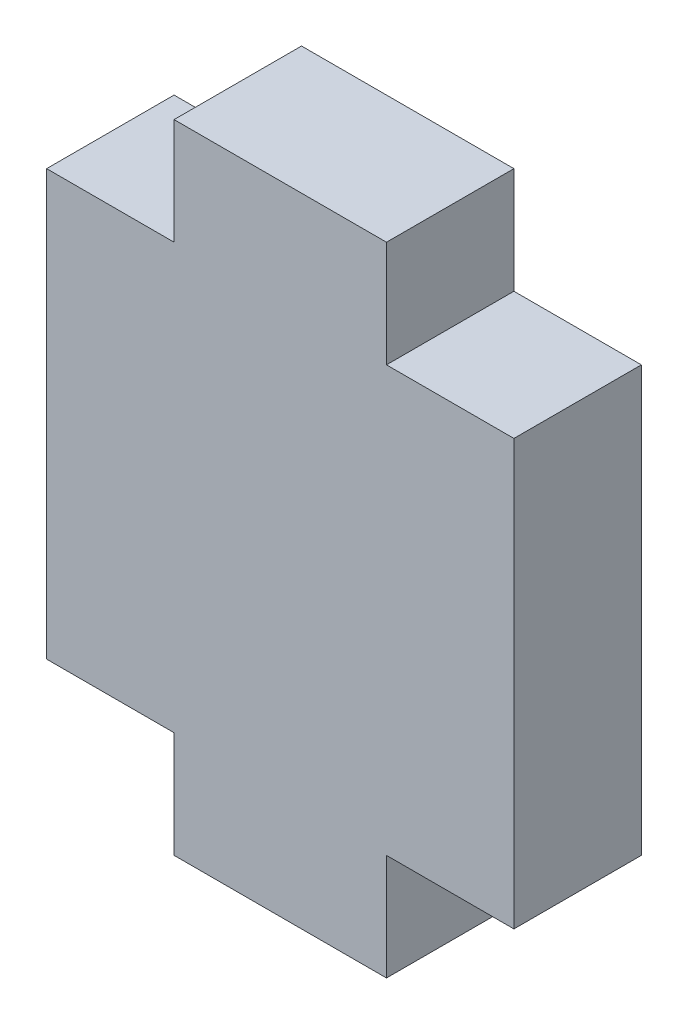
ISO-10303-21;
HEADER;
FILE_DESCRIPTION(('STEP AP214'),'2;1');
FILE_NAME('part.step','',(''),(''),'','','');
FILE_SCHEMA(('AUTOMOTIVE_DESIGN { 1 0 10303 214 1 1 1 1 }'));
ENDSEC;
DATA;
#1=APPLICATION_CONTEXT('core data for automotive mechanical design processes');
#2=APPLICATION_PROTOCOL_DEFINITION('international standard','automotive_design',2000,#1);
#3=PRODUCT_CONTEXT('',#1,'mechanical');
#4=PRODUCT('Part','Part','',(#3));
#5=PRODUCT_RELATED_PRODUCT_CATEGORY('part','',(#4));
#6=PRODUCT_DEFINITION_FORMATION('','',#4);
#7=PRODUCT_DEFINITION_CONTEXT('part definition',#1,'design');
#8=PRODUCT_DEFINITION('design','',#6,#7);
#9=PRODUCT_DEFINITION_SHAPE('','',#8);
#10=(LENGTH_UNIT() NAMED_UNIT(*) SI_UNIT(.MILLI.,.METRE.));
#11=(NAMED_UNIT(*) PLANE_ANGLE_UNIT() SI_UNIT($,.RADIAN.));
#12=(NAMED_UNIT(*) SI_UNIT($,.STERADIAN.) SOLID_ANGLE_UNIT());
#13=UNCERTAINTY_MEASURE_WITH_UNIT(LENGTH_MEASURE(1.E-05),#10,'distance_accuracy_value','');
#14=(GEOMETRIC_REPRESENTATION_CONTEXT(3) GLOBAL_UNCERTAINTY_ASSIGNED_CONTEXT((#13)) GLOBAL_UNIT_ASSIGNED_CONTEXT((#10,
#11,#12)) REPRESENTATION_CONTEXT('',''));
#15=CARTESIAN_POINT('',(0.,0.,0.));
#16=DIRECTION('',(0.,0.,1.));
#17=DIRECTION('',(1.,0.,0.));
#18=AXIS2_PLACEMENT_3D('',#15,#16,#17);
#19=CARTESIAN_POINT('',(0.,5.,3.));
#20=DIRECTION('',(0.,-1.,0.));
#21=DIRECTION('',(0.,0.,-1.));
#22=AXIS2_PLACEMENT_3D('',#19,#20,#21);
#23=PLANE('',#22);
#24=DIRECTION('',(-1.,0.,0.));
#25=VECTOR('',#24,1.);
#26=CARTESIAN_POINT('',(0.,5.,0.));
#27=LINE('',#26,#25);
#28=CARTESIAN_POINT('',(-2.5,5.,0.));
#29=VERTEX_POINT('',#28);
#30=CARTESIAN_POINT('',(-5.5,5.,0.));
#31=VERTEX_POINT('',#30);
#32=EDGE_CURVE('E158',#29,#31,#27,.T.);
#33=ORIENTED_EDGE('',*,*,#32,.T.);
#34=DIRECTION('',(0.,0.,-1.));
#35=VECTOR('',#34,1.);
#36=CARTESIAN_POINT('',(-5.5,5.,3.));
#37=LINE('',#36,#35);
#38=CARTESIAN_POINT('',(-5.5,5.,3.));
#39=VERTEX_POINT('',#38);
#40=EDGE_CURVE('E11',#39,#31,#37,.T.);
#41=ORIENTED_EDGE('',*,*,#40,.F.);
#42=DIRECTION('',(-1.,0.,0.));
#43=VECTOR('',#42,1.);
#44=CARTESIAN_POINT('',(0.,5.,3.));
#45=LINE('',#44,#43);
#46=CARTESIAN_POINT('',(-2.5,5.,3.));
#47=VERTEX_POINT('',#46);
#48=EDGE_CURVE('E236',#47,#39,#45,.T.);
#49=ORIENTED_EDGE('',*,*,#48,.F.);
#50=DIRECTION('',(0.,0.,-1.));
#51=VECTOR('',#50,1.);
#52=CARTESIAN_POINT('',(-2.5,5.,3.));
#53=LINE('',#52,#51);
#54=EDGE_CURVE('E152',#47,#29,#53,.T.);
#55=ORIENTED_EDGE('',*,*,#54,.T.);
#56=EDGE_LOOP('',(#33,#41,#49,#55));
#57=FACE_BOUND('',#56,.T.);
#58=ADVANCED_FACE('F36',(#57),#23,.F.);
#59=CARTESIAN_POINT('',(-5.5,0.,3.));
#60=DIRECTION('',(1.,0.,0.));
#61=DIRECTION('',(0.,1.,0.));
#62=AXIS2_PLACEMENT_3D('',#59,#60,#61);
#63=PLANE('',#62);
#64=DIRECTION('',(0.,-1.,0.));
#65=VECTOR('',#64,1.);
#66=CARTESIAN_POINT('',(-5.5,0.,0.));
#67=LINE('',#66,#65);
#68=CARTESIAN_POINT('',(-5.5,-5.,0.));
#69=VERTEX_POINT('',#68);
#70=EDGE_CURVE('E161',#31,#69,#67,.T.);
#71=ORIENTED_EDGE('',*,*,#70,.T.);
#72=DIRECTION('',(0.,0.,-1.));
#73=VECTOR('',#72,1.);
#74=CARTESIAN_POINT('',(-5.5,-5.,3.));
#75=LINE('',#74,#73);
#76=CARTESIAN_POINT('',(-5.5,-5.,3.));
#77=VERTEX_POINT('',#76);
#78=EDGE_CURVE('E44',#77,#69,#75,.T.);
#79=ORIENTED_EDGE('',*,*,#78,.F.);
#80=DIRECTION('',(0.,-1.,0.));
#81=VECTOR('',#80,1.);
#82=CARTESIAN_POINT('',(-5.5,0.,3.));
#83=LINE('',#82,#81);
#84=EDGE_CURVE('E103',#39,#77,#83,.T.);
#85=ORIENTED_EDGE('',*,*,#84,.F.);
#86=ORIENTED_EDGE('',*,*,#40,.T.);
#87=EDGE_LOOP('',(#71,#79,#85,#86));
#88=FACE_BOUND('',#87,.T.);
#89=ADVANCED_FACE('F207',(#88),#63,.F.);
#90=CARTESIAN_POINT('',(0.,-5.,3.));
#91=DIRECTION('',(0.,-1.,0.));
#92=DIRECTION('',(1.,0.,0.));
#93=AXIS2_PLACEMENT_3D('',#90,#91,#92);
#94=PLANE('',#93);
#95=DIRECTION('',(-1.,0.,0.));
#96=VECTOR('',#95,1.);
#97=CARTESIAN_POINT('',(0.,-5.,0.));
#98=LINE('',#97,#96);
#99=CARTESIAN_POINT('',(-2.5,-5.,0.));
#100=VERTEX_POINT('',#99);
#101=EDGE_CURVE('E164',#100,#69,#98,.T.);
#102=ORIENTED_EDGE('',*,*,#101,.F.);
#103=DIRECTION('',(0.,0.,-1.));
#104=VECTOR('',#103,1.);
#105=CARTESIAN_POINT('',(-2.5,-5.,3.));
#106=LINE('',#105,#104);
#107=CARTESIAN_POINT('',(-2.5,-5.,3.));
#108=VERTEX_POINT('',#107);
#109=EDGE_CURVE('E200',#108,#100,#106,.T.);
#110=ORIENTED_EDGE('',*,*,#109,.F.);
#111=DIRECTION('',(-1.,0.,0.));
#112=VECTOR('',#111,1.);
#113=CARTESIAN_POINT('',(0.,-5.,3.));
#114=LINE('',#113,#112);
#115=EDGE_CURVE('E206',#108,#77,#114,.T.);
#116=ORIENTED_EDGE('',*,*,#115,.T.);
#117=ORIENTED_EDGE('',*,*,#78,.T.);
#118=EDGE_LOOP('',(#102,#110,#116,#117));
#119=FACE_BOUND('',#118,.T.);
#120=ADVANCED_FACE('F204',(#119),#94,.T.);
#121=CARTESIAN_POINT('',(-2.5,0.,3.));
#122=DIRECTION('',(1.,0.,0.));
#123=DIRECTION('',(0.,1.,0.));
#124=AXIS2_PLACEMENT_3D('',#121,#122,#123);
#125=PLANE('',#124);
#126=DIRECTION('',(0.,-1.,0.));
#127=VECTOR('',#126,1.);
#128=CARTESIAN_POINT('',(-2.5,0.,0.));
#129=LINE('',#128,#127);
#130=CARTESIAN_POINT('',(-2.5,-7.5,0.));
#131=VERTEX_POINT('',#130);
#132=EDGE_CURVE('E167',#100,#131,#129,.T.);
#133=ORIENTED_EDGE('',*,*,#132,.T.);
#134=DIRECTION('',(0.,0.,-1.));
#135=VECTOR('',#134,1.);
#136=CARTESIAN_POINT('',(-2.5,-7.5,3.));
#137=LINE('',#136,#135);
#138=CARTESIAN_POINT('',(-2.5,-7.5,3.));
#139=VERTEX_POINT('',#138);
#140=EDGE_CURVE('E197',#139,#131,#137,.T.);
#141=ORIENTED_EDGE('',*,*,#140,.F.);
#142=DIRECTION('',(0.,-1.,0.));
#143=VECTOR('',#142,1.);
#144=CARTESIAN_POINT('',(-2.5,0.,3.));
#145=LINE('',#144,#143);
#146=EDGE_CURVE('E154',#108,#139,#145,.T.);
#147=ORIENTED_EDGE('',*,*,#146,.F.);
#148=ORIENTED_EDGE('',*,*,#109,.T.);
#149=EDGE_LOOP('',(#133,#141,#147,#148));
#150=FACE_BOUND('',#149,.T.);
#151=ADVANCED_FACE('F216',(#150),#125,.F.);
#152=CARTESIAN_POINT('',(0.,-7.5,3.));
#153=DIRECTION('',(0.,1.,0.));
#154=DIRECTION('',(0.,0.,1.));
#155=AXIS2_PLACEMENT_3D('',#152,#153,#154);
#156=PLANE('',#155);
#157=DIRECTION('',(1.,0.,0.));
#158=VECTOR('',#157,1.);
#159=CARTESIAN_POINT('',(0.,-7.5,0.));
#160=LINE('',#159,#158);
#161=CARTESIAN_POINT('',(2.5,-7.5,0.));
#162=VERTEX_POINT('',#161);
#163=EDGE_CURVE('E169',#131,#162,#160,.T.);
#164=ORIENTED_EDGE('',*,*,#163,.T.);
#165=DIRECTION('',(0.,0.,-1.));
#166=VECTOR('',#165,1.);
#167=CARTESIAN_POINT('',(2.5,-7.5,3.));
#168=LINE('',#167,#166);
#169=CARTESIAN_POINT('',(2.5,-7.5,3.));
#170=VERTEX_POINT('',#169);
#171=EDGE_CURVE('E195',#170,#162,#168,.T.);
#172=ORIENTED_EDGE('',*,*,#171,.F.);
#173=DIRECTION('',(1.,0.,0.));
#174=VECTOR('',#173,1.);
#175=CARTESIAN_POINT('',(0.,-7.5,3.));
#176=LINE('',#175,#174);
#177=EDGE_CURVE('E222',#139,#170,#176,.T.);
#178=ORIENTED_EDGE('',*,*,#177,.F.);
#179=ORIENTED_EDGE('',*,*,#140,.T.);
#180=EDGE_LOOP('',(#164,#172,#178,#179));
#181=FACE_BOUND('',#180,.T.);
#182=ADVANCED_FACE('F220',(#181),#156,.F.);
#183=CARTESIAN_POINT('',(2.5,0.,3.));
#184=DIRECTION('',(1.,0.,0.));
#185=DIRECTION('',(0.,1.,0.));
#186=AXIS2_PLACEMENT_3D('',#183,#184,#185);
#187=PLANE('',#186);
#188=DIRECTION('',(0.,-1.,0.));
#189=VECTOR('',#188,1.);
#190=CARTESIAN_POINT('',(2.5,0.,0.));
#191=LINE('',#190,#189);
#192=CARTESIAN_POINT('',(2.5,-5.,0.));
#193=VERTEX_POINT('',#192);
#194=EDGE_CURVE('E172',#193,#162,#191,.T.);
#195=ORIENTED_EDGE('',*,*,#194,.F.);
#196=DIRECTION('',(0.,0.,-1.));
#197=VECTOR('',#196,1.);
#198=CARTESIAN_POINT('',(2.5,-5.,3.));
#199=LINE('',#198,#197);
#200=CARTESIAN_POINT('',(2.5,-5.,3.));
#201=VERTEX_POINT('',#200);
#202=EDGE_CURVE('E193',#201,#193,#199,.T.);
#203=ORIENTED_EDGE('',*,*,#202,.F.);
#204=DIRECTION('',(0.,-1.,0.));
#205=VECTOR('',#204,1.);
#206=CARTESIAN_POINT('',(2.5,0.,3.));
#207=LINE('',#206,#205);
#208=EDGE_CURVE('E149',#201,#170,#207,.T.);
#209=ORIENTED_EDGE('',*,*,#208,.T.);
#210=ORIENTED_EDGE('',*,*,#171,.T.);
#211=EDGE_LOOP('',(#195,#203,#209,#210));
#212=FACE_BOUND('',#211,.T.);
#213=ADVANCED_FACE('F263',(#212),#187,.T.);
#214=CARTESIAN_POINT('',(0.,-5.,3.));
#215=DIRECTION('',(0.,1.,0.));
#216=DIRECTION('',(-1.,0.,0.));
#217=AXIS2_PLACEMENT_3D('',#214,#215,#216);
#218=PLANE('',#217);
#219=DIRECTION('',(1.,0.,0.));
#220=VECTOR('',#219,1.);
#221=CARTESIAN_POINT('',(0.,-5.,0.));
#222=LINE('',#221,#220);
#223=CARTESIAN_POINT('',(5.5,-5.,0.));
#224=VERTEX_POINT('',#223);
#225=EDGE_CURVE('E175',#193,#224,#222,.T.);
#226=ORIENTED_EDGE('',*,*,#225,.T.);
#227=DIRECTION('',(0.,0.,-1.));
#228=VECTOR('',#227,1.);
#229=CARTESIAN_POINT('',(5.5,-5.,3.));
#230=LINE('',#229,#228);
#231=CARTESIAN_POINT('',(5.5,-5.,3.));
#232=VERTEX_POINT('',#231);
#233=EDGE_CURVE('E191',#232,#224,#230,.T.);
#234=ORIENTED_EDGE('',*,*,#233,.F.);
#235=DIRECTION('',(1.,0.,0.));
#236=VECTOR('',#235,1.);
#237=CARTESIAN_POINT('',(0.,-5.,3.));
#238=LINE('',#237,#236);
#239=EDGE_CURVE('E226',#201,#232,#238,.T.);
#240=ORIENTED_EDGE('',*,*,#239,.F.);
#241=ORIENTED_EDGE('',*,*,#202,.T.);
#242=EDGE_LOOP('',(#226,#234,#240,#241));
#243=FACE_BOUND('',#242,.T.);
#244=ADVANCED_FACE('F264',(#243),#218,.F.);
#245=CARTESIAN_POINT('',(5.5,0.,3.));
#246=DIRECTION('',(1.,0.,0.));
#247=DIRECTION('',(0.,1.,0.));
#248=AXIS2_PLACEMENT_3D('',#245,#246,#247);
#249=PLANE('',#248);
#250=DIRECTION('',(0.,-1.,0.));
#251=VECTOR('',#250,1.);
#252=CARTESIAN_POINT('',(5.5,0.,0.));
#253=LINE('',#252,#251);
#254=CARTESIAN_POINT('',(5.5,5.,0.));
#255=VERTEX_POINT('',#254);
#256=EDGE_CURVE('E178',#255,#224,#253,.T.);
#257=ORIENTED_EDGE('',*,*,#256,.F.);
#258=DIRECTION('',(0.,0.,-1.));
#259=VECTOR('',#258,1.);
#260=CARTESIAN_POINT('',(5.5,5.,3.));
#261=LINE('',#260,#259);
#262=CARTESIAN_POINT('',(5.5,5.,3.));
#263=VERTEX_POINT('',#262);
#264=EDGE_CURVE('E189',#263,#255,#261,.T.);
#265=ORIENTED_EDGE('',*,*,#264,.F.);
#266=DIRECTION('',(0.,-1.,0.));
#267=VECTOR('',#266,1.);
#268=CARTESIAN_POINT('',(5.5,0.,3.));
#269=LINE('',#268,#267);
#270=EDGE_CURVE('E229',#263,#232,#269,.T.);
#271=ORIENTED_EDGE('',*,*,#270,.T.);
#272=ORIENTED_EDGE('',*,*,#233,.T.);
#273=EDGE_LOOP('',(#257,#265,#271,#272));
#274=FACE_BOUND('',#273,.T.);
#275=ADVANCED_FACE('F267',(#274),#249,.T.);
#276=CARTESIAN_POINT('',(0.,5.,3.));
#277=DIRECTION('',(0.,1.,0.));
#278=DIRECTION('',(0.,0.,1.));
#279=AXIS2_PLACEMENT_3D('',#276,#277,#278);
#280=PLANE('',#279);
#281=DIRECTION('',(1.,0.,0.));
#282=VECTOR('',#281,1.);
#283=CARTESIAN_POINT('',(0.,5.,0.));
#284=LINE('',#283,#282);
#285=CARTESIAN_POINT('',(2.5,5.,0.));
#286=VERTEX_POINT('',#285);
#287=EDGE_CURVE('E181',#286,#255,#284,.T.);
#288=ORIENTED_EDGE('',*,*,#287,.F.);
#289=DIRECTION('',(0.,0.,-1.));
#290=VECTOR('',#289,1.);
#291=CARTESIAN_POINT('',(2.5,5.,3.));
#292=LINE('',#291,#290);
#293=CARTESIAN_POINT('',(2.5,5.,3.));
#294=VERTEX_POINT('',#293);
#295=EDGE_CURVE('E140',#294,#286,#292,.T.);
#296=ORIENTED_EDGE('',*,*,#295,.F.);
#297=DIRECTION('',(1.,0.,0.));
#298=VECTOR('',#297,1.);
#299=CARTESIAN_POINT('',(0.,5.,3.));
#300=LINE('',#299,#298);
#301=EDGE_CURVE('E147',#294,#263,#300,.T.);
#302=ORIENTED_EDGE('',*,*,#301,.T.);
#303=ORIENTED_EDGE('',*,*,#264,.T.);
#304=EDGE_LOOP('',(#288,#296,#302,#303));
#305=FACE_BOUND('',#304,.T.);
#306=ADVANCED_FACE('F234',(#305),#280,.T.);
#307=CARTESIAN_POINT('',(2.5,7.5,0.));
#308=VERTEX_POINT('',#307);
#309=EDGE_CURVE('E135',#308,#286,#191,.T.);
#310=ORIENTED_EDGE('',*,*,#309,.F.);
#311=DIRECTION('',(0.,0.,-1.));
#312=VECTOR('',#311,1.);
#313=CARTESIAN_POINT('',(2.5,7.5,3.));
#314=LINE('',#313,#312);
#315=CARTESIAN_POINT('',(2.5,7.5,3.));
#316=VERTEX_POINT('',#315);
#317=EDGE_CURVE('E130',#316,#308,#314,.T.);
#318=ORIENTED_EDGE('',*,*,#317,.F.);
#319=EDGE_CURVE('E133',#316,#294,#207,.T.);
#320=ORIENTED_EDGE('',*,*,#319,.T.);
#321=ORIENTED_EDGE('',*,*,#295,.T.);
#322=EDGE_LOOP('',(#310,#318,#320,#321));
#323=FACE_BOUND('',#322,.T.);
#324=ADVANCED_FACE('F132',(#323),#187,.T.);
#325=CARTESIAN_POINT('',(0.,7.5,3.));
#326=DIRECTION('',(0.,1.,0.));
#327=DIRECTION('',(0.,0.,1.));
#328=AXIS2_PLACEMENT_3D('',#325,#326,#327);
#329=PLANE('',#328);
#330=DIRECTION('',(1.,0.,0.));
#331=VECTOR('',#330,1.);
#332=CARTESIAN_POINT('',(0.,7.5,0.));
#333=LINE('',#332,#331);
#334=CARTESIAN_POINT('',(-2.5,7.5,0.));
#335=VERTEX_POINT('',#334);
#336=EDGE_CURVE('E184',#335,#308,#333,.T.);
#337=ORIENTED_EDGE('',*,*,#336,.F.);
#338=DIRECTION('',(0.,0.,-1.));
#339=VECTOR('',#338,1.);
#340=CARTESIAN_POINT('',(-2.5,7.5,3.));
#341=LINE('',#340,#339);
#342=CARTESIAN_POINT('',(-2.5,7.5,3.));
#343=VERTEX_POINT('',#342);
#344=EDGE_CURVE('E92',#343,#335,#341,.T.);
#345=ORIENTED_EDGE('',*,*,#344,.F.);
#346=DIRECTION('',(1.,0.,0.));
#347=VECTOR('',#346,1.);
#348=CARTESIAN_POINT('',(0.,7.5,3.));
#349=LINE('',#348,#347);
#350=EDGE_CURVE('E144',#343,#316,#349,.T.);
#351=ORIENTED_EDGE('',*,*,#350,.T.);
#352=ORIENTED_EDGE('',*,*,#317,.T.);
#353=EDGE_LOOP('',(#337,#345,#351,#352));
#354=FACE_BOUND('',#353,.T.);
#355=ADVANCED_FACE('F150',(#354),#329,.T.);
#356=EDGE_CURVE('E95',#335,#29,#129,.T.);
#357=ORIENTED_EDGE('',*,*,#356,.T.);
#358=ORIENTED_EDGE('',*,*,#54,.F.);
#359=EDGE_CURVE('E52',#343,#47,#145,.T.);
#360=ORIENTED_EDGE('',*,*,#359,.F.);
#361=ORIENTED_EDGE('',*,*,#344,.T.);
#362=EDGE_LOOP('',(#357,#358,#360,#361));
#363=FACE_BOUND('',#362,.T.);
#364=ADVANCED_FACE('F241',(#363),#125,.F.);
#365=CARTESIAN_POINT('',(0.,0.,3.));
#366=DIRECTION('',(0.,0.,1.));
#367=DIRECTION('',(1.,0.,0.));
#368=AXIS2_PLACEMENT_3D('',#365,#366,#367);
#369=PLANE('',#368);
#370=ORIENTED_EDGE('',*,*,#48,.T.);
#371=ORIENTED_EDGE('',*,*,#84,.T.);
#372=ORIENTED_EDGE('',*,*,#115,.F.);
#373=ORIENTED_EDGE('',*,*,#146,.T.);
#374=ORIENTED_EDGE('',*,*,#177,.T.);
#375=ORIENTED_EDGE('',*,*,#208,.F.);
#376=ORIENTED_EDGE('',*,*,#239,.T.);
#377=ORIENTED_EDGE('',*,*,#270,.F.);
#378=ORIENTED_EDGE('',*,*,#301,.F.);
#379=ORIENTED_EDGE('',*,*,#319,.F.);
#380=ORIENTED_EDGE('',*,*,#350,.F.);
#381=ORIENTED_EDGE('',*,*,#359,.T.);
#382=EDGE_LOOP('',(#370,#371,#372,#373,#374,#375,#376,#377,#378,#379,#380,#381));
#383=FACE_BOUND('',#382,.T.);
#384=ADVANCED_FACE('F143',(#383),#369,.T.);
#385=CARTESIAN_POINT('',(0.,0.,0.));
#386=DIRECTION('',(0.,0.,1.));
#387=DIRECTION('',(1.,0.,0.));
#388=AXIS2_PLACEMENT_3D('',#385,#386,#387);
#389=PLANE('',#388);
#390=ORIENTED_EDGE('',*,*,#32,.F.);
#391=ORIENTED_EDGE('',*,*,#356,.F.);
#392=ORIENTED_EDGE('',*,*,#336,.T.);
#393=ORIENTED_EDGE('',*,*,#309,.T.);
#394=ORIENTED_EDGE('',*,*,#287,.T.);
#395=ORIENTED_EDGE('',*,*,#256,.T.);
#396=ORIENTED_EDGE('',*,*,#225,.F.);
#397=ORIENTED_EDGE('',*,*,#194,.T.);
#398=ORIENTED_EDGE('',*,*,#163,.F.);
#399=ORIENTED_EDGE('',*,*,#132,.F.);
#400=ORIENTED_EDGE('',*,*,#101,.T.);
#401=ORIENTED_EDGE('',*,*,#70,.F.);
#402=EDGE_LOOP('',(#390,#391,#392,#393,#394,#395,#396,#397,#398,#399,#400,#401));
#403=FACE_BOUND('',#402,.T.);
#404=ADVANCED_FACE('F212',(#403),#389,.F.);
#405=CLOSED_SHELL('',(#58,#89,#120,#151,#182,#213,#244,#275,#306,#324,#355,#364,#384,#404));
#406=MANIFOLD_SOLID_BREP('B2',#405);
#407=ADVANCED_BREP_SHAPE_REPRESENTATION('',(#18,#406),#14);
#408=SHAPE_DEFINITION_REPRESENTATION(#9,#407);
ENDSEC;
END-ISO-10303-21;
